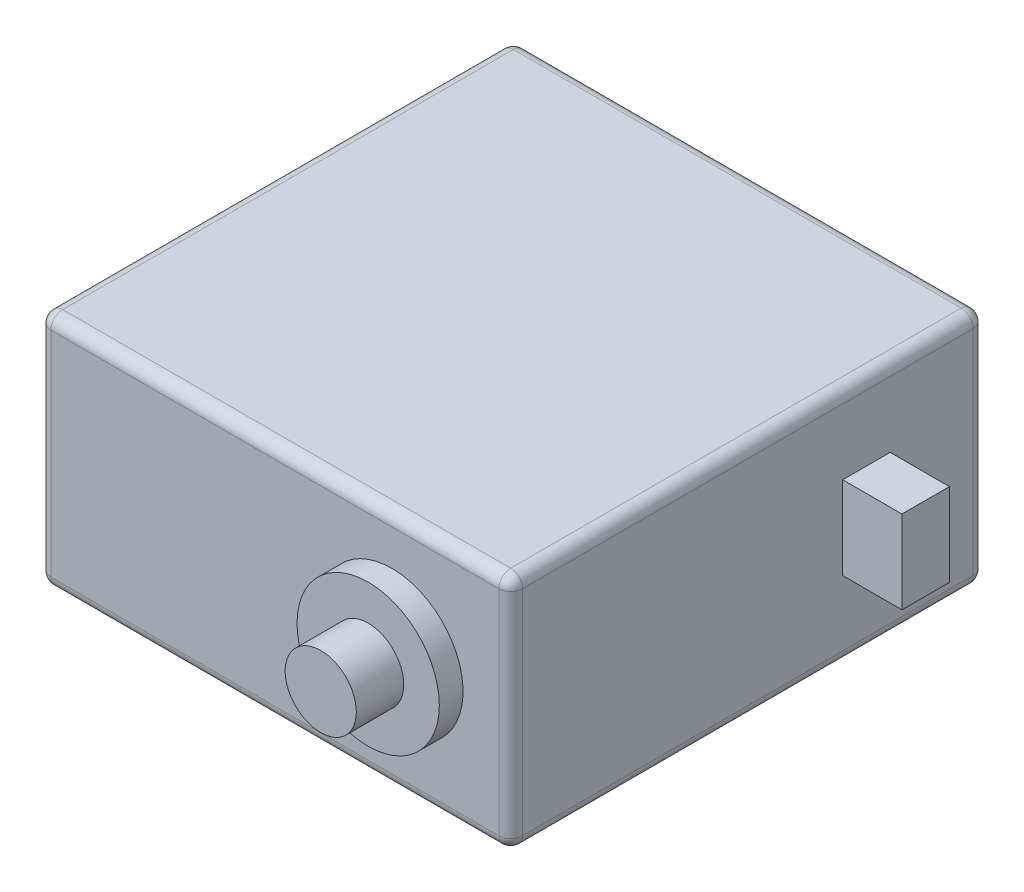
ISO-10303-21;
HEADER;
FILE_DESCRIPTION(('STEP AP214'),'2;1');
FILE_NAME('part.step','',(''),(''),'','','');
FILE_SCHEMA(('AUTOMOTIVE_DESIGN { 1 0 10303 214 1 1 1 1 }'));
ENDSEC;
DATA;
#1=APPLICATION_CONTEXT('core data for automotive mechanical design processes');
#2=APPLICATION_PROTOCOL_DEFINITION('international standard','automotive_design',2000,#1);
#3=PRODUCT_CONTEXT('',#1,'mechanical');
#4=PRODUCT('Part','Part','',(#3));
#5=PRODUCT_RELATED_PRODUCT_CATEGORY('part','',(#4));
#6=PRODUCT_DEFINITION_FORMATION('','',#4);
#7=PRODUCT_DEFINITION_CONTEXT('part definition',#1,'design');
#8=PRODUCT_DEFINITION('design','',#6,#7);
#9=PRODUCT_DEFINITION_SHAPE('','',#8);
#10=(LENGTH_UNIT() NAMED_UNIT(*) SI_UNIT(.MILLI.,.METRE.));
#11=(NAMED_UNIT(*) PLANE_ANGLE_UNIT() SI_UNIT($,.RADIAN.));
#12=(NAMED_UNIT(*) SI_UNIT($,.STERADIAN.) SOLID_ANGLE_UNIT());
#13=UNCERTAINTY_MEASURE_WITH_UNIT(LENGTH_MEASURE(1.E-05),#10,'distance_accuracy_value','');
#14=(GEOMETRIC_REPRESENTATION_CONTEXT(3) GLOBAL_UNCERTAINTY_ASSIGNED_CONTEXT((#13)) GLOBAL_UNIT_ASSIGNED_CONTEXT((#10,
#11,#12)) REPRESENTATION_CONTEXT('',''));
#15=CARTESIAN_POINT('',(0.,0.,0.));
#16=DIRECTION('',(0.,0.,1.));
#17=DIRECTION('',(1.,0.,0.));
#18=AXIS2_PLACEMENT_3D('',#15,#16,#17);
#19=CARTESIAN_POINT('',(19.89,20.04,-20.));
#20=DIRECTION('',(-1.,0.,0.));
#21=DIRECTION('',(0.,0.,1.));
#22=AXIS2_PLACEMENT_3D('',#19,#20,#21);
#23=PLANE('',#22);
#24=DIRECTION('',(0.,0.,-1.));
#25=VECTOR('',#24,1.);
#26=CARTESIAN_POINT('',(19.89,19.04,-20.));
#27=LINE('',#26,#25);
#28=CARTESIAN_POINT('',(19.89,19.04,-19.));
#29=VERTEX_POINT('',#28);
#30=CARTESIAN_POINT('',(19.89,19.04,19.));
#31=VERTEX_POINT('',#30);
#32=EDGE_CURVE('E51',#29,#31,#27,.F.);
#33=ORIENTED_EDGE('',*,*,#32,.T.);
#34=DIRECTION('',(0.,-1.,0.));
#35=VECTOR('',#34,1.);
#36=CARTESIAN_POINT('',(19.89,20.04,19.));
#37=LINE('',#36,#35);
#38=CARTESIAN_POINT('',(19.89,1.,19.));
#39=VERTEX_POINT('',#38);
#40=EDGE_CURVE('E11',#31,#39,#37,.T.);
#41=ORIENTED_EDGE('',*,*,#40,.T.);
#42=DIRECTION('',(0.,0.,-1.));
#43=VECTOR('',#42,1.);
#44=CARTESIAN_POINT('',(19.89,1.,-20.));
#45=LINE('',#44,#43);
#46=CARTESIAN_POINT('',(19.89,1.,-19.));
#47=VERTEX_POINT('',#46);
#48=EDGE_CURVE('E243',#39,#47,#45,.T.);
#49=ORIENTED_EDGE('',*,*,#48,.T.);
#50=DIRECTION('',(0.,-1.,0.));
#51=VECTOR('',#50,1.);
#52=CARTESIAN_POINT('',(19.89,20.04,-19.));
#53=LINE('',#52,#51);
#54=EDGE_CURVE('E245',#47,#29,#53,.F.);
#55=ORIENTED_EDGE('',*,*,#54,.T.);
#56=EDGE_LOOP('',(#33,#41,#49,#55));
#57=FACE_BOUND('',#56,.T.);
#58=DIRECTION('',(0.,-1.,0.));
#59=VECTOR('',#58,1.);
#60=CARTESIAN_POINT('',(19.89,13.5,-8.));
#61=LINE('',#60,#59);
#62=CARTESIAN_POINT('',(19.89,13.5,-8.));
#63=VERTEX_POINT('',#62);
#64=CARTESIAN_POINT('',(19.89,6.5,-8.));
#65=VERTEX_POINT('',#64);
#66=EDGE_CURVE('E177',#63,#65,#61,.T.);
#67=ORIENTED_EDGE('',*,*,#66,.F.);
#68=DIRECTION('',(0.,0.,1.));
#69=VECTOR('',#68,1.);
#70=CARTESIAN_POINT('',(19.89,13.5,-12.));
#71=LINE('',#70,#69);
#72=CARTESIAN_POINT('',(19.89,13.5,-12.));
#73=VERTEX_POINT('',#72);
#74=EDGE_CURVE('E174',#73,#63,#71,.T.);
#75=ORIENTED_EDGE('',*,*,#74,.F.);
#76=DIRECTION('',(0.,1.,0.));
#77=VECTOR('',#76,1.);
#78=CARTESIAN_POINT('',(19.89,13.5,-12.));
#79=LINE('',#78,#77);
#80=CARTESIAN_POINT('',(19.89,6.5,-12.));
#81=VERTEX_POINT('',#80);
#82=EDGE_CURVE('E64',#81,#73,#79,.T.);
#83=ORIENTED_EDGE('',*,*,#82,.F.);
#84=DIRECTION('',(0.,0.,-1.));
#85=VECTOR('',#84,1.);
#86=CARTESIAN_POINT('',(19.89,6.5,-12.));
#87=LINE('',#86,#85);
#88=EDGE_CURVE('E59',#65,#81,#87,.T.);
#89=ORIENTED_EDGE('',*,*,#88,.F.);
#90=EDGE_LOOP('',(#67,#75,#83,#89));
#91=FACE_BOUND('',#90,.T.);
#92=ADVANCED_FACE('F42',(#57,#91),#23,.F.);
#93=CARTESIAN_POINT('',(-19.89,20.04,-20.));
#94=DIRECTION('',(1.,0.,0.));
#95=DIRECTION('',(0.,0.,-1.));
#96=AXIS2_PLACEMENT_3D('',#93,#94,#95);
#97=PLANE('',#96);
#98=DIRECTION('',(0.,-1.,0.));
#99=VECTOR('',#98,1.);
#100=CARTESIAN_POINT('',(-19.89,20.04,19.));
#101=LINE('',#100,#99);
#102=CARTESIAN_POINT('',(-19.89,1.,19.));
#103=VERTEX_POINT('',#102);
#104=CARTESIAN_POINT('',(-19.89,19.04,19.));
#105=VERTEX_POINT('',#104);
#106=EDGE_CURVE('E200',#103,#105,#101,.F.);
#107=ORIENTED_EDGE('',*,*,#106,.T.);
#108=DIRECTION('',(0.,0.,1.));
#109=VECTOR('',#108,1.);
#110=CARTESIAN_POINT('',(-19.89,19.04,-20.));
#111=LINE('',#110,#109);
#112=CARTESIAN_POINT('',(-19.89,19.04,-19.));
#113=VERTEX_POINT('',#112);
#114=EDGE_CURVE('E205',#105,#113,#111,.F.);
#115=ORIENTED_EDGE('',*,*,#114,.T.);
#116=DIRECTION('',(0.,-1.,0.));
#117=VECTOR('',#116,1.);
#118=CARTESIAN_POINT('',(-19.89,20.04,-19.));
#119=LINE('',#118,#117);
#120=CARTESIAN_POINT('',(-19.89,1.,-19.));
#121=VERTEX_POINT('',#120);
#122=EDGE_CURVE('E202',#113,#121,#119,.T.);
#123=ORIENTED_EDGE('',*,*,#122,.T.);
#124=DIRECTION('',(0.,0.,1.));
#125=VECTOR('',#124,1.);
#126=CARTESIAN_POINT('',(-19.89,1.,20.));
#127=LINE('',#126,#125);
#128=EDGE_CURVE('E193',#121,#103,#127,.T.);
#129=ORIENTED_EDGE('',*,*,#128,.T.);
#130=EDGE_LOOP('',(#107,#115,#123,#129));
#131=FACE_BOUND('',#130,.T.);
#132=ADVANCED_FACE('F399',(#131),#97,.F.);
#133=CARTESIAN_POINT('',(19.89,20.04,20.));
#134=DIRECTION('',(0.,0.,-1.));
#135=DIRECTION('',(-1.,0.,0.));
#136=AXIS2_PLACEMENT_3D('',#133,#134,#135);
#137=PLANE('',#136);
#138=DIRECTION('',(1.,0.,0.));
#139=VECTOR('',#138,1.);
#140=CARTESIAN_POINT('',(19.89,19.04,20.));
#141=LINE('',#140,#139);
#142=CARTESIAN_POINT('',(18.89,19.04,20.));
#143=VERTEX_POINT('',#142);
#144=CARTESIAN_POINT('',(-18.89,19.04,20.));
#145=VERTEX_POINT('',#144);
#146=EDGE_CURVE('E220',#143,#145,#141,.F.);
#147=ORIENTED_EDGE('',*,*,#146,.T.);
#148=DIRECTION('',(0.,-1.,0.));
#149=VECTOR('',#148,1.);
#150=CARTESIAN_POINT('',(-18.89,20.04,20.));
#151=LINE('',#150,#149);
#152=CARTESIAN_POINT('',(-18.89,1.,20.));
#153=VERTEX_POINT('',#152);
#154=EDGE_CURVE('E222',#145,#153,#151,.T.);
#155=ORIENTED_EDGE('',*,*,#154,.T.);
#156=DIRECTION('',(1.,0.,0.));
#157=VECTOR('',#156,1.);
#158=CARTESIAN_POINT('',(19.89,1.,20.));
#159=LINE('',#158,#157);
#160=CARTESIAN_POINT('',(18.89,1.,20.));
#161=VERTEX_POINT('',#160);
#162=EDGE_CURVE('E218',#153,#161,#159,.T.);
#163=ORIENTED_EDGE('',*,*,#162,.T.);
#164=DIRECTION('',(0.,-1.,0.));
#165=VECTOR('',#164,1.);
#166=CARTESIAN_POINT('',(18.89,20.04,20.));
#167=LINE('',#166,#165);
#168=EDGE_CURVE('E216',#161,#143,#167,.F.);
#169=ORIENTED_EDGE('',*,*,#168,.T.);
#170=EDGE_LOOP('',(#147,#155,#163,#169));
#171=FACE_BOUND('',#170,.T.);
#172=CARTESIAN_POINT('',(9.87,10.02,20.));
#173=DIRECTION('',(0.,0.,-1.));
#174=DIRECTION('',(-1.,0.,0.));
#175=AXIS2_PLACEMENT_3D('',#172,#173,#174);
#176=CIRCLE('',#175,6.);
#177=CARTESIAN_POINT('',(3.87,10.02,20.));
#178=VERTEX_POINT('',#177);
#179=EDGE_CURVE('E194',#178,#178,#176,.F.);
#180=ORIENTED_EDGE('',*,*,#179,.F.);
#181=EDGE_LOOP('',(#180));
#182=FACE_BOUND('',#181,.T.);
#183=ADVANCED_FACE('F339',(#171,#182),#137,.F.);
#184=CARTESIAN_POINT('',(19.89,20.04,-20.));
#185=DIRECTION('',(0.,0.,1.));
#186=DIRECTION('',(1.,0.,0.));
#187=AXIS2_PLACEMENT_3D('',#184,#185,#186);
#188=PLANE('',#187);
#189=CARTESIAN_POINT('',(9.87,10.02,-20.));
#190=DIRECTION('',(0.,0.,1.));
#191=DIRECTION('',(1.,0.,0.));
#192=AXIS2_PLACEMENT_3D('',#189,#190,#191);
#193=CIRCLE('',#192,6.);
#194=CARTESIAN_POINT('',(15.87,10.02,-20.));
#195=VERTEX_POINT('',#194);
#196=EDGE_CURVE('E750',#195,#195,#193,.T.);
#197=ORIENTED_EDGE('',*,*,#196,.T.);
#198=EDGE_LOOP('',(#197));
#199=FACE_BOUND('',#198,.T.);
#200=DIRECTION('',(-1.,0.,0.));
#201=VECTOR('',#200,1.);
#202=CARTESIAN_POINT('',(-19.89,1.,-20.));
#203=LINE('',#202,#201);
#204=CARTESIAN_POINT('',(18.89,1.,-20.));
#205=VERTEX_POINT('',#204);
#206=CARTESIAN_POINT('',(-18.89,1.,-20.));
#207=VERTEX_POINT('',#206);
#208=EDGE_CURVE('E209',#205,#207,#203,.T.);
#209=ORIENTED_EDGE('',*,*,#208,.T.);
#210=DIRECTION('',(0.,-1.,0.));
#211=VECTOR('',#210,1.);
#212=CARTESIAN_POINT('',(-18.89,20.04,-20.));
#213=LINE('',#212,#211);
#214=CARTESIAN_POINT('',(-18.89,19.04,-20.));
#215=VERTEX_POINT('',#214);
#216=EDGE_CURVE('E213',#207,#215,#213,.F.);
#217=ORIENTED_EDGE('',*,*,#216,.T.);
#218=DIRECTION('',(-1.,0.,0.));
#219=VECTOR('',#218,1.);
#220=CARTESIAN_POINT('',(19.89,19.04,-20.));
#221=LINE('',#220,#219);
#222=CARTESIAN_POINT('',(18.89,19.04,-20.));
#223=VERTEX_POINT('',#222);
#224=EDGE_CURVE('E211',#215,#223,#221,.F.);
#225=ORIENTED_EDGE('',*,*,#224,.T.);
#226=DIRECTION('',(0.,-1.,0.));
#227=VECTOR('',#226,1.);
#228=CARTESIAN_POINT('',(18.89,20.04,-20.));
#229=LINE('',#228,#227);
#230=EDGE_CURVE('E207',#223,#205,#229,.T.);
#231=ORIENTED_EDGE('',*,*,#230,.T.);
#232=EDGE_LOOP('',(#209,#217,#225,#231));
#233=FACE_BOUND('',#232,.T.);
#234=ADVANCED_FACE('F374',(#199,#233),#188,.F.);
#235=CARTESIAN_POINT('',(0.,20.04,0.));
#236=DIRECTION('',(0.,-1.,0.));
#237=DIRECTION('',(0.,0.,-1.));
#238=AXIS2_PLACEMENT_3D('',#235,#236,#237);
#239=PLANE('',#238);
#240=DIRECTION('',(-1.,0.,0.));
#241=VECTOR('',#240,1.);
#242=CARTESIAN_POINT('',(0.,20.04,-19.));
#243=LINE('',#242,#241);
#244=CARTESIAN_POINT('',(18.89,20.04,-19.));
#245=VERTEX_POINT('',#244);
#246=CARTESIAN_POINT('',(-18.89,20.04,-19.));
#247=VERTEX_POINT('',#246);
#248=EDGE_CURVE('E229',#245,#247,#243,.T.);
#249=ORIENTED_EDGE('',*,*,#248,.T.);
#250=DIRECTION('',(0.,0.,1.));
#251=VECTOR('',#250,1.);
#252=CARTESIAN_POINT('',(-18.89,20.04,0.));
#253=LINE('',#252,#251);
#254=CARTESIAN_POINT('',(-18.89,20.04,19.));
#255=VERTEX_POINT('',#254);
#256=EDGE_CURVE('E232',#247,#255,#253,.T.);
#257=ORIENTED_EDGE('',*,*,#256,.T.);
#258=DIRECTION('',(1.,0.,0.));
#259=VECTOR('',#258,1.);
#260=CARTESIAN_POINT('',(0.,20.04,19.));
#261=LINE('',#260,#259);
#262=CARTESIAN_POINT('',(18.89,20.04,19.));
#263=VERTEX_POINT('',#262);
#264=EDGE_CURVE('E227',#255,#263,#261,.T.);
#265=ORIENTED_EDGE('',*,*,#264,.T.);
#266=DIRECTION('',(0.,0.,-1.));
#267=VECTOR('',#266,1.);
#268=CARTESIAN_POINT('',(18.89,20.04,0.));
#269=LINE('',#268,#267);
#270=EDGE_CURVE('E225',#263,#245,#269,.T.);
#271=ORIENTED_EDGE('',*,*,#270,.T.);
#272=EDGE_LOOP('',(#249,#257,#265,#271));
#273=FACE_BOUND('',#272,.T.);
#274=ADVANCED_FACE('F330',(#273),#239,.F.);
#275=CARTESIAN_POINT('',(0.,0.,0.));
#276=DIRECTION('',(0.,-1.,0.));
#277=DIRECTION('',(0.,0.,-1.));
#278=AXIS2_PLACEMENT_3D('',#275,#276,#277);
#279=PLANE('',#278);
#280=DIRECTION('',(1.,0.,0.));
#281=VECTOR('',#280,1.);
#282=CARTESIAN_POINT('',(-19.89,0.,19.));
#283=LINE('',#282,#281);
#284=CARTESIAN_POINT('',(18.89,0.,19.));
#285=VERTEX_POINT('',#284);
#286=CARTESIAN_POINT('',(-18.89,0.,19.));
#287=VERTEX_POINT('',#286);
#288=EDGE_CURVE('E238',#285,#287,#283,.F.);
#289=ORIENTED_EDGE('',*,*,#288,.T.);
#290=DIRECTION('',(0.,0.,1.));
#291=VECTOR('',#290,1.);
#292=CARTESIAN_POINT('',(-18.89,0.,-20.));
#293=LINE('',#292,#291);
#294=CARTESIAN_POINT('',(-18.89,0.,-19.));
#295=VERTEX_POINT('',#294);
#296=EDGE_CURVE('E241',#287,#295,#293,.F.);
#297=ORIENTED_EDGE('',*,*,#296,.T.);
#298=DIRECTION('',(-1.,0.,0.));
#299=VECTOR('',#298,1.);
#300=CARTESIAN_POINT('',(19.89,0.,-19.));
#301=LINE('',#300,#299);
#302=CARTESIAN_POINT('',(18.89,0.,-19.));
#303=VERTEX_POINT('',#302);
#304=EDGE_CURVE('E236',#295,#303,#301,.F.);
#305=ORIENTED_EDGE('',*,*,#304,.T.);
#306=DIRECTION('',(0.,0.,-1.));
#307=VECTOR('',#306,1.);
#308=CARTESIAN_POINT('',(18.89,0.,20.));
#309=LINE('',#308,#307);
#310=EDGE_CURVE('E234',#303,#285,#309,.F.);
#311=ORIENTED_EDGE('',*,*,#310,.T.);
#312=EDGE_LOOP('',(#289,#297,#305,#311));
#313=FACE_BOUND('',#312,.T.);
#314=ADVANCED_FACE('F616',(#313),#279,.T.);
#315=CARTESIAN_POINT('',(9.87,10.02,22.));
#316=DIRECTION('',(0.,0.,-1.));
#317=DIRECTION('',(-1.,0.,0.));
#318=AXIS2_PLACEMENT_3D('',#315,#316,#317);
#319=CYLINDRICAL_SURFACE('',#318,6.);
#320=CARTESIAN_POINT('',(9.87,10.02,22.));
#321=DIRECTION('',(0.,0.,1.));
#322=DIRECTION('',(1.,0.,0.));
#323=AXIS2_PLACEMENT_3D('',#320,#321,#322);
#324=CIRCLE('',#323,6.);
#325=CARTESIAN_POINT('',(15.87,10.02,22.));
#326=VERTEX_POINT('',#325);
#327=EDGE_CURVE('E189',#326,#326,#324,.T.);
#328=ORIENTED_EDGE('',*,*,#327,.F.);
#329=EDGE_LOOP('',(#328));
#330=FACE_BOUND('',#329,.T.);
#331=ORIENTED_EDGE('',*,*,#179,.T.);
#332=EDGE_LOOP('',(#331));
#333=FACE_BOUND('',#332,.T.);
#334=ADVANCED_FACE('F607',(#330,#333),#319,.T.);
#335=CARTESIAN_POINT('',(9.87,10.02,22.));
#336=DIRECTION('',(0.,0.,1.));
#337=DIRECTION('',(1.,0.,0.));
#338=AXIS2_PLACEMENT_3D('',#335,#336,#337);
#339=PLANE('',#338);
#340=CARTESIAN_POINT('',(9.87,10.02,22.));
#341=DIRECTION('',(0.,0.,1.));
#342=DIRECTION('',(1.,0.,0.));
#343=AXIS2_PLACEMENT_3D('',#340,#341,#342);
#344=CIRCLE('',#343,3.);
#345=CARTESIAN_POINT('',(12.87,10.02,22.));
#346=VERTEX_POINT('',#345);
#347=EDGE_CURVE('E190',#346,#346,#344,.T.);
#348=ORIENTED_EDGE('',*,*,#347,.F.);
#349=EDGE_LOOP('',(#348));
#350=FACE_BOUND('',#349,.T.);
#351=ORIENTED_EDGE('',*,*,#327,.T.);
#352=EDGE_LOOP('',(#351));
#353=FACE_BOUND('',#352,.T.);
#354=ADVANCED_FACE('F597',(#350,#353),#339,.T.);
#355=CARTESIAN_POINT('',(9.87,10.02,26.));
#356=DIRECTION('',(0.,0.,-1.));
#357=DIRECTION('',(-1.,0.,0.));
#358=AXIS2_PLACEMENT_3D('',#355,#356,#357);
#359=CYLINDRICAL_SURFACE('',#358,3.);
#360=CARTESIAN_POINT('',(9.87,10.02,26.));
#361=DIRECTION('',(0.,0.,1.));
#362=DIRECTION('',(1.,0.,0.));
#363=AXIS2_PLACEMENT_3D('',#360,#361,#362);
#364=CIRCLE('',#363,3.);
#365=CARTESIAN_POINT('',(12.87,10.02,26.));
#366=VERTEX_POINT('',#365);
#367=EDGE_CURVE('E186',#366,#366,#364,.T.);
#368=ORIENTED_EDGE('',*,*,#367,.F.);
#369=EDGE_LOOP('',(#368));
#370=FACE_BOUND('',#369,.T.);
#371=ORIENTED_EDGE('',*,*,#347,.T.);
#372=EDGE_LOOP('',(#371));
#373=FACE_BOUND('',#372,.T.);
#374=ADVANCED_FACE('F587',(#370,#373),#359,.T.);
#375=CARTESIAN_POINT('',(9.87,10.02,26.));
#376=DIRECTION('',(0.,0.,1.));
#377=DIRECTION('',(1.,0.,0.));
#378=AXIS2_PLACEMENT_3D('',#375,#376,#377);
#379=PLANE('',#378);
#380=ORIENTED_EDGE('',*,*,#367,.T.);
#381=EDGE_LOOP('',(#380));
#382=FACE_BOUND('',#381,.T.);
#383=ADVANCED_FACE('F583',(#382),#379,.T.);
#384=CARTESIAN_POINT('',(18.89,20.04,19.));
#385=DIRECTION('',(0.,-1.,0.));
#386=DIRECTION('',(0.,0.,-1.));
#387=AXIS2_PLACEMENT_3D('',#384,#385,#386);
#388=CYLINDRICAL_SURFACE('',#387,1.);
#389=CARTESIAN_POINT('',(18.89,19.04,19.));
#390=DIRECTION('',(0.,1.,0.));
#391=DIRECTION('',(0.,0.,1.));
#392=AXIS2_PLACEMENT_3D('',#389,#390,#391);
#393=CIRCLE('',#392,1.);
#394=EDGE_CURVE('E46',#143,#31,#393,.T.);
#395=ORIENTED_EDGE('',*,*,#394,.F.);
#396=ORIENTED_EDGE('',*,*,#168,.F.);
#397=CARTESIAN_POINT('',(18.89,1.,19.));
#398=DIRECTION('',(0.,-1.,0.));
#399=DIRECTION('',(0.,0.,-1.));
#400=AXIS2_PLACEMENT_3D('',#397,#398,#399);
#401=CIRCLE('',#400,1.);
#402=EDGE_CURVE('E306',#39,#161,#401,.T.);
#403=ORIENTED_EDGE('',*,*,#402,.F.);
#404=ORIENTED_EDGE('',*,*,#40,.F.);
#405=EDGE_LOOP('',(#395,#396,#403,#404));
#406=FACE_BOUND('',#405,.T.);
#407=ADVANCED_FACE('F44',(#406),#388,.T.);
#408=CARTESIAN_POINT('',(18.89,19.04,19.));
#409=DIRECTION('',(1.,0.,0.));
#410=DIRECTION('',(0.,0.,-1.));
#411=AXIS2_PLACEMENT_3D('',#408,#409,#410);
#412=SPHERICAL_SURFACE('',#411,1.);
#413=CARTESIAN_POINT('',(18.89,19.04,19.));
#414=DIRECTION('',(1.,0.,0.));
#415=DIRECTION('',(0.,0.,-1.));
#416=AXIS2_PLACEMENT_3D('',#413,#414,#415);
#417=CIRCLE('',#416,1.);
#418=EDGE_CURVE('E301',#143,#263,#417,.F.);
#419=ORIENTED_EDGE('',*,*,#418,.F.);
#420=ORIENTED_EDGE('',*,*,#394,.T.);
#421=CARTESIAN_POINT('',(18.89,19.04,19.));
#422=DIRECTION('',(0.,0.,1.));
#423=DIRECTION('',(0.,-1.,0.));
#424=AXIS2_PLACEMENT_3D('',#421,#422,#423);
#425=CIRCLE('',#424,1.);
#426=EDGE_CURVE('E304',#263,#31,#425,.F.);
#427=ORIENTED_EDGE('',*,*,#426,.F.);
#428=EDGE_LOOP('',(#419,#420,#427));
#429=FACE_BOUND('',#428,.T.);
#430=ADVANCED_FACE('F317',(#429),#412,.T.);
#431=CARTESIAN_POINT('',(18.89,1.,19.));
#432=DIRECTION('',(0.,0.,1.));
#433=DIRECTION('',(0.,-1.,0.));
#434=AXIS2_PLACEMENT_3D('',#431,#432,#433);
#435=SPHERICAL_SURFACE('',#434,1.);
#436=CARTESIAN_POINT('',(18.89,1.,19.));
#437=DIRECTION('',(0.,0.,1.));
#438=DIRECTION('',(1.,0.,0.));
#439=AXIS2_PLACEMENT_3D('',#436,#437,#438);
#440=CIRCLE('',#439,1.);
#441=EDGE_CURVE('E295',#39,#285,#440,.F.);
#442=ORIENTED_EDGE('',*,*,#441,.F.);
#443=ORIENTED_EDGE('',*,*,#402,.T.);
#444=CARTESIAN_POINT('',(18.89,1.,19.));
#445=DIRECTION('',(1.,0.,0.));
#446=DIRECTION('',(0.,0.,-1.));
#447=AXIS2_PLACEMENT_3D('',#444,#445,#446);
#448=CIRCLE('',#447,1.);
#449=EDGE_CURVE('E298',#285,#161,#448,.F.);
#450=ORIENTED_EDGE('',*,*,#449,.F.);
#451=EDGE_LOOP('',(#442,#443,#450));
#452=FACE_BOUND('',#451,.T.);
#453=ADVANCED_FACE('F657',(#452),#435,.T.);
#454=CARTESIAN_POINT('',(18.89,19.04,0.));
#455=DIRECTION('',(0.,0.,-1.));
#456=DIRECTION('',(-1.,0.,0.));
#457=AXIS2_PLACEMENT_3D('',#454,#455,#456);
#458=CYLINDRICAL_SURFACE('',#457,1.);
#459=ORIENTED_EDGE('',*,*,#426,.T.);
#460=ORIENTED_EDGE('',*,*,#32,.F.);
#461=CARTESIAN_POINT('',(18.89,19.04,-19.));
#462=DIRECTION('',(0.,0.,-1.));
#463=DIRECTION('',(-1.,0.,0.));
#464=AXIS2_PLACEMENT_3D('',#461,#462,#463);
#465=CIRCLE('',#464,1.);
#466=EDGE_CURVE('E289',#245,#29,#465,.T.);
#467=ORIENTED_EDGE('',*,*,#466,.F.);
#468=ORIENTED_EDGE('',*,*,#270,.F.);
#469=EDGE_LOOP('',(#459,#460,#467,#468));
#470=FACE_BOUND('',#469,.T.);
#471=ADVANCED_FACE('F325',(#470),#458,.T.);
#472=CARTESIAN_POINT('',(0.,19.04,19.));
#473=DIRECTION('',(1.,0.,0.));
#474=DIRECTION('',(0.,0.,-1.));
#475=AXIS2_PLACEMENT_3D('',#472,#473,#474);
#476=CYLINDRICAL_SURFACE('',#475,1.);
#477=ORIENTED_EDGE('',*,*,#418,.T.);
#478=ORIENTED_EDGE('',*,*,#264,.F.);
#479=CARTESIAN_POINT('',(-18.89,19.04,19.));
#480=DIRECTION('',(-1.,0.,0.));
#481=DIRECTION('',(0.,0.,1.));
#482=AXIS2_PLACEMENT_3D('',#479,#480,#481);
#483=CIRCLE('',#482,1.);
#484=EDGE_CURVE('E286',#145,#255,#483,.T.);
#485=ORIENTED_EDGE('',*,*,#484,.F.);
#486=ORIENTED_EDGE('',*,*,#146,.F.);
#487=EDGE_LOOP('',(#477,#478,#485,#486));
#488=FACE_BOUND('',#487,.T.);
#489=ADVANCED_FACE('F336',(#488),#476,.T.);
#490=CARTESIAN_POINT('',(-18.89,20.04,19.));
#491=DIRECTION('',(0.,-1.,0.));
#492=DIRECTION('',(0.,0.,-1.));
#493=AXIS2_PLACEMENT_3D('',#490,#491,#492);
#494=CYLINDRICAL_SURFACE('',#493,1.);
#495=CARTESIAN_POINT('',(-18.89,1.,19.));
#496=DIRECTION('',(0.,-1.,0.));
#497=DIRECTION('',(0.,0.,-1.));
#498=AXIS2_PLACEMENT_3D('',#495,#496,#497);
#499=CIRCLE('',#498,1.);
#500=EDGE_CURVE('E280',#153,#103,#499,.T.);
#501=ORIENTED_EDGE('',*,*,#500,.F.);
#502=ORIENTED_EDGE('',*,*,#154,.F.);
#503=CARTESIAN_POINT('',(-18.89,19.04,19.));
#504=DIRECTION('',(0.,1.,0.));
#505=DIRECTION('',(0.,0.,1.));
#506=AXIS2_PLACEMENT_3D('',#503,#504,#505);
#507=CIRCLE('',#506,1.);
#508=EDGE_CURVE('E283',#105,#145,#507,.T.);
#509=ORIENTED_EDGE('',*,*,#508,.F.);
#510=ORIENTED_EDGE('',*,*,#106,.F.);
#511=EDGE_LOOP('',(#501,#502,#509,#510));
#512=FACE_BOUND('',#511,.T.);
#513=ADVANCED_FACE('F344',(#512),#494,.T.);
#514=CARTESIAN_POINT('',(19.89,1.,19.));
#515=DIRECTION('',(-1.,0.,0.));
#516=DIRECTION('',(0.,0.,1.));
#517=AXIS2_PLACEMENT_3D('',#514,#515,#516);
#518=CYLINDRICAL_SURFACE('',#517,1.);
#519=ORIENTED_EDGE('',*,*,#449,.T.);
#520=ORIENTED_EDGE('',*,*,#162,.F.);
#521=CARTESIAN_POINT('',(-18.89,1.,19.));
#522=DIRECTION('',(-1.,0.,0.));
#523=DIRECTION('',(0.,0.,1.));
#524=AXIS2_PLACEMENT_3D('',#521,#522,#523);
#525=CIRCLE('',#524,1.);
#526=EDGE_CURVE('E278',#287,#153,#525,.T.);
#527=ORIENTED_EDGE('',*,*,#526,.F.);
#528=ORIENTED_EDGE('',*,*,#288,.F.);
#529=EDGE_LOOP('',(#519,#520,#527,#528));
#530=FACE_BOUND('',#529,.T.);
#531=ADVANCED_FACE('F352',(#530),#518,.T.);
#532=CARTESIAN_POINT('',(18.89,1.,-20.));
#533=DIRECTION('',(0.,0.,1.));
#534=DIRECTION('',(1.,0.,0.));
#535=AXIS2_PLACEMENT_3D('',#532,#533,#534);
#536=CYLINDRICAL_SURFACE('',#535,1.);
#537=ORIENTED_EDGE('',*,*,#441,.T.);
#538=ORIENTED_EDGE('',*,*,#310,.F.);
#539=CARTESIAN_POINT('',(18.89,1.,-19.));
#540=DIRECTION('',(0.,0.,-1.));
#541=DIRECTION('',(-1.,0.,0.));
#542=AXIS2_PLACEMENT_3D('',#539,#540,#541);
#543=CIRCLE('',#542,1.);
#544=EDGE_CURVE('E275',#47,#303,#543,.T.);
#545=ORIENTED_EDGE('',*,*,#544,.F.);
#546=ORIENTED_EDGE('',*,*,#48,.F.);
#547=EDGE_LOOP('',(#537,#538,#545,#546));
#548=FACE_BOUND('',#547,.T.);
#549=ADVANCED_FACE('F364',(#548),#536,.T.);
#550=CARTESIAN_POINT('',(18.89,20.04,-19.));
#551=DIRECTION('',(0.,-1.,0.));
#552=DIRECTION('',(0.,0.,-1.));
#553=AXIS2_PLACEMENT_3D('',#550,#551,#552);
#554=CYLINDRICAL_SURFACE('',#553,1.);
#555=CARTESIAN_POINT('',(18.89,19.04,-19.));
#556=DIRECTION('',(0.,1.,0.));
#557=DIRECTION('',(0.,0.,1.));
#558=AXIS2_PLACEMENT_3D('',#555,#556,#557);
#559=CIRCLE('',#558,1.);
#560=EDGE_CURVE('E292',#29,#223,#559,.T.);
#561=ORIENTED_EDGE('',*,*,#560,.F.);
#562=ORIENTED_EDGE('',*,*,#54,.F.);
#563=CARTESIAN_POINT('',(18.89,1.,-19.));
#564=DIRECTION('',(0.,-1.,0.));
#565=DIRECTION('',(0.,0.,-1.));
#566=AXIS2_PLACEMENT_3D('',#563,#564,#565);
#567=CIRCLE('',#566,1.);
#568=EDGE_CURVE('E272',#205,#47,#567,.T.);
#569=ORIENTED_EDGE('',*,*,#568,.F.);
#570=ORIENTED_EDGE('',*,*,#230,.F.);
#571=EDGE_LOOP('',(#561,#562,#569,#570));
#572=FACE_BOUND('',#571,.T.);
#573=ADVANCED_FACE('F359',(#572),#554,.T.);
#574=CARTESIAN_POINT('',(18.89,19.04,-19.));
#575=DIRECTION('',(1.,0.,0.));
#576=DIRECTION('',(0.,0.,-1.));
#577=AXIS2_PLACEMENT_3D('',#574,#575,#576);
#578=SPHERICAL_SURFACE('',#577,1.);
#579=ORIENTED_EDGE('',*,*,#466,.T.);
#580=ORIENTED_EDGE('',*,*,#560,.T.);
#581=CARTESIAN_POINT('',(18.89,19.04,-19.));
#582=DIRECTION('',(1.,0.,0.));
#583=DIRECTION('',(0.,1.,0.));
#584=AXIS2_PLACEMENT_3D('',#581,#582,#583);
#585=CIRCLE('',#584,1.);
#586=EDGE_CURVE('E269',#245,#223,#585,.F.);
#587=ORIENTED_EDGE('',*,*,#586,.F.);
#588=EDGE_LOOP('',(#579,#580,#587));
#589=FACE_BOUND('',#588,.T.);
#590=ADVANCED_FACE('F377',(#589),#578,.T.);
#591=CARTESIAN_POINT('',(-18.89,19.04,19.));
#592=DIRECTION('',(0.,0.,1.));
#593=DIRECTION('',(1.,0.,0.));
#594=AXIS2_PLACEMENT_3D('',#591,#592,#593);
#595=SPHERICAL_SURFACE('',#594,1.);
#596=ORIENTED_EDGE('',*,*,#508,.T.);
#597=ORIENTED_EDGE('',*,*,#484,.T.);
#598=CARTESIAN_POINT('',(-18.89,19.04,19.));
#599=DIRECTION('',(0.,0.,1.));
#600=DIRECTION('',(1.,0.,0.));
#601=AXIS2_PLACEMENT_3D('',#598,#599,#600);
#602=CIRCLE('',#601,1.);
#603=EDGE_CURVE('E266',#105,#255,#602,.F.);
#604=ORIENTED_EDGE('',*,*,#603,.F.);
#605=EDGE_LOOP('',(#596,#597,#604));
#606=FACE_BOUND('',#605,.T.);
#607=ADVANCED_FACE('F388',(#606),#595,.T.);
#608=CARTESIAN_POINT('',(-18.89,1.,19.));
#609=DIRECTION('',(0.,0.,1.));
#610=DIRECTION('',(0.,-1.,0.));
#611=AXIS2_PLACEMENT_3D('',#608,#609,#610);
#612=SPHERICAL_SURFACE('',#611,1.);
#613=ORIENTED_EDGE('',*,*,#526,.T.);
#614=ORIENTED_EDGE('',*,*,#500,.T.);
#615=CARTESIAN_POINT('',(-18.89,1.,19.));
#616=DIRECTION('',(0.,0.,1.));
#617=DIRECTION('',(1.,0.,0.));
#618=AXIS2_PLACEMENT_3D('',#615,#616,#617);
#619=CIRCLE('',#618,1.);
#620=EDGE_CURVE('E263',#287,#103,#619,.F.);
#621=ORIENTED_EDGE('',*,*,#620,.F.);
#622=EDGE_LOOP('',(#613,#614,#621));
#623=FACE_BOUND('',#622,.T.);
#624=ADVANCED_FACE('F390',(#623),#612,.T.);
#625=CARTESIAN_POINT('',(18.89,1.,-19.));
#626=DIRECTION('',(1.,0.,0.));
#627=DIRECTION('',(0.,1.,0.));
#628=AXIS2_PLACEMENT_3D('',#625,#626,#627);
#629=SPHERICAL_SURFACE('',#628,1.);
#630=ORIENTED_EDGE('',*,*,#568,.T.);
#631=ORIENTED_EDGE('',*,*,#544,.T.);
#632=CARTESIAN_POINT('',(18.89,1.,-19.));
#633=DIRECTION('',(1.,0.,0.));
#634=DIRECTION('',(0.,0.,-1.));
#635=AXIS2_PLACEMENT_3D('',#632,#633,#634);
#636=CIRCLE('',#635,1.);
#637=EDGE_CURVE('E260',#205,#303,#636,.F.);
#638=ORIENTED_EDGE('',*,*,#637,.F.);
#639=EDGE_LOOP('',(#630,#631,#638));
#640=FACE_BOUND('',#639,.T.);
#641=ADVANCED_FACE('F366',(#640),#629,.T.);
#642=CARTESIAN_POINT('',(0.,19.04,-19.));
#643=DIRECTION('',(-1.,0.,0.));
#644=DIRECTION('',(0.,0.,1.));
#645=AXIS2_PLACEMENT_3D('',#642,#643,#644);
#646=CYLINDRICAL_SURFACE('',#645,1.);
#647=ORIENTED_EDGE('',*,*,#586,.T.);
#648=ORIENTED_EDGE('',*,*,#224,.F.);
#649=CARTESIAN_POINT('',(-18.89,19.04,-19.));
#650=DIRECTION('',(-1.,0.,0.));
#651=DIRECTION('',(0.,0.,1.));
#652=AXIS2_PLACEMENT_3D('',#649,#650,#651);
#653=CIRCLE('',#652,1.);
#654=EDGE_CURVE('E257',#247,#215,#653,.T.);
#655=ORIENTED_EDGE('',*,*,#654,.F.);
#656=ORIENTED_EDGE('',*,*,#248,.F.);
#657=EDGE_LOOP('',(#647,#648,#655,#656));
#658=FACE_BOUND('',#657,.T.);
#659=ADVANCED_FACE('F379',(#658),#646,.T.);
#660=CARTESIAN_POINT('',(-18.89,19.04,0.));
#661=DIRECTION('',(0.,0.,1.));
#662=DIRECTION('',(1.,0.,0.));
#663=AXIS2_PLACEMENT_3D('',#660,#661,#662);
#664=CYLINDRICAL_SURFACE('',#663,1.);
#665=ORIENTED_EDGE('',*,*,#603,.T.);
#666=ORIENTED_EDGE('',*,*,#256,.F.);
#667=CARTESIAN_POINT('',(-18.89,19.04,-19.));
#668=DIRECTION('',(0.,0.,-1.));
#669=DIRECTION('',(-1.,0.,0.));
#670=AXIS2_PLACEMENT_3D('',#667,#668,#669);
#671=CIRCLE('',#670,1.);
#672=EDGE_CURVE('E255',#113,#247,#671,.T.);
#673=ORIENTED_EDGE('',*,*,#672,.F.);
#674=ORIENTED_EDGE('',*,*,#114,.F.);
#675=EDGE_LOOP('',(#665,#666,#673,#674));
#676=FACE_BOUND('',#675,.T.);
#677=ADVANCED_FACE('F385',(#676),#664,.T.);
#678=CARTESIAN_POINT('',(-18.89,1.,-20.));
#679=DIRECTION('',(0.,0.,-1.));
#680=DIRECTION('',(-1.,0.,0.));
#681=AXIS2_PLACEMENT_3D('',#678,#679,#680);
#682=CYLINDRICAL_SURFACE('',#681,1.);
#683=ORIENTED_EDGE('',*,*,#620,.T.);
#684=ORIENTED_EDGE('',*,*,#128,.F.);
#685=CARTESIAN_POINT('',(-18.89,1.,-19.));
#686=DIRECTION('',(0.,0.,-1.));
#687=DIRECTION('',(-1.,0.,0.));
#688=AXIS2_PLACEMENT_3D('',#685,#686,#687);
#689=CIRCLE('',#688,1.);
#690=EDGE_CURVE('E252',#295,#121,#689,.T.);
#691=ORIENTED_EDGE('',*,*,#690,.F.);
#692=ORIENTED_EDGE('',*,*,#296,.F.);
#693=EDGE_LOOP('',(#683,#684,#691,#692));
#694=FACE_BOUND('',#693,.T.);
#695=ADVANCED_FACE('F425',(#694),#682,.T.);
#696=CARTESIAN_POINT('',(19.89,1.,-19.));
#697=DIRECTION('',(1.,0.,0.));
#698=DIRECTION('',(0.,0.,-1.));
#699=AXIS2_PLACEMENT_3D('',#696,#697,#698);
#700=CYLINDRICAL_SURFACE('',#699,1.);
#701=ORIENTED_EDGE('',*,*,#637,.T.);
#702=ORIENTED_EDGE('',*,*,#304,.F.);
#703=CARTESIAN_POINT('',(-18.89,1.,-19.));
#704=DIRECTION('',(-1.,0.,0.));
#705=DIRECTION('',(0.,0.,1.));
#706=AXIS2_PLACEMENT_3D('',#703,#704,#705);
#707=CIRCLE('',#706,1.);
#708=EDGE_CURVE('E249',#207,#295,#707,.T.);
#709=ORIENTED_EDGE('',*,*,#708,.F.);
#710=ORIENTED_EDGE('',*,*,#208,.F.);
#711=EDGE_LOOP('',(#701,#702,#709,#710));
#712=FACE_BOUND('',#711,.T.);
#713=ADVANCED_FACE('F371',(#712),#700,.T.);
#714=CARTESIAN_POINT('',(-18.89,19.04,-19.));
#715=DIRECTION('',(0.,1.,0.));
#716=DIRECTION('',(0.,0.,1.));
#717=AXIS2_PLACEMENT_3D('',#714,#715,#716);
#718=SPHERICAL_SURFACE('',#717,1.);
#719=ORIENTED_EDGE('',*,*,#672,.T.);
#720=ORIENTED_EDGE('',*,*,#654,.T.);
#721=CARTESIAN_POINT('',(-18.89,19.04,-19.));
#722=DIRECTION('',(0.,1.,0.));
#723=DIRECTION('',(0.,0.,1.));
#724=AXIS2_PLACEMENT_3D('',#721,#722,#723);
#725=CIRCLE('',#724,1.);
#726=EDGE_CURVE('E180',#113,#215,#725,.F.);
#727=ORIENTED_EDGE('',*,*,#726,.F.);
#728=EDGE_LOOP('',(#719,#720,#727));
#729=FACE_BOUND('',#728,.T.);
#730=ADVANCED_FACE('F419',(#729),#718,.T.);
#731=CARTESIAN_POINT('',(-18.89,1.,-19.));
#732=DIRECTION('',(0.,-1.,0.));
#733=DIRECTION('',(0.,0.,-1.));
#734=AXIS2_PLACEMENT_3D('',#731,#732,#733);
#735=SPHERICAL_SURFACE('',#734,1.);
#736=ORIENTED_EDGE('',*,*,#708,.T.);
#737=ORIENTED_EDGE('',*,*,#690,.T.);
#738=CARTESIAN_POINT('',(-18.89,1.,-19.));
#739=DIRECTION('',(0.,-1.,0.));
#740=DIRECTION('',(0.,0.,-1.));
#741=AXIS2_PLACEMENT_3D('',#738,#739,#740);
#742=CIRCLE('',#741,1.);
#743=EDGE_CURVE('E178',#207,#121,#742,.F.);
#744=ORIENTED_EDGE('',*,*,#743,.F.);
#745=EDGE_LOOP('',(#736,#737,#744));
#746=FACE_BOUND('',#745,.T.);
#747=ADVANCED_FACE('F415',(#746),#735,.T.);
#748=CARTESIAN_POINT('',(-18.89,20.04,-19.));
#749=DIRECTION('',(0.,-1.,0.));
#750=DIRECTION('',(0.,0.,-1.));
#751=AXIS2_PLACEMENT_3D('',#748,#749,#750);
#752=CYLINDRICAL_SURFACE('',#751,1.);
#753=ORIENTED_EDGE('',*,*,#726,.T.);
#754=ORIENTED_EDGE('',*,*,#216,.F.);
#755=ORIENTED_EDGE('',*,*,#743,.T.);
#756=ORIENTED_EDGE('',*,*,#122,.F.);
#757=EDGE_LOOP('',(#753,#754,#755,#756));
#758=FACE_BOUND('',#757,.T.);
#759=ADVANCED_FACE('F413',(#758),#752,.T.);
#760=CARTESIAN_POINT('',(24.89,13.5,-8.));
#761=DIRECTION('',(0.,0.,-1.));
#762=DIRECTION('',(0.,1.,0.));
#763=AXIS2_PLACEMENT_3D('',#760,#761,#762);
#764=PLANE('',#763);
#765=ORIENTED_EDGE('',*,*,#66,.T.);
#766=DIRECTION('',(-1.,0.,0.));
#767=VECTOR('',#766,1.);
#768=CARTESIAN_POINT('',(24.89,6.5,-8.));
#769=LINE('',#768,#767);
#770=CARTESIAN_POINT('',(24.89,6.5,-8.));
#771=VERTEX_POINT('',#770);
#772=EDGE_CURVE('E158',#771,#65,#769,.T.);
#773=ORIENTED_EDGE('',*,*,#772,.F.);
#774=DIRECTION('',(0.,-1.,0.));
#775=VECTOR('',#774,1.);
#776=CARTESIAN_POINT('',(24.89,13.5,-8.));
#777=LINE('',#776,#775);
#778=CARTESIAN_POINT('',(24.89,13.5,-8.));
#779=VERTEX_POINT('',#778);
#780=EDGE_CURVE('E165',#779,#771,#777,.T.);
#781=ORIENTED_EDGE('',*,*,#780,.F.);
#782=DIRECTION('',(-1.,0.,0.));
#783=VECTOR('',#782,1.);
#784=CARTESIAN_POINT('',(24.89,13.5,-8.));
#785=LINE('',#784,#783);
#786=EDGE_CURVE('E764',#779,#63,#785,.T.);
#787=ORIENTED_EDGE('',*,*,#786,.T.);
#788=EDGE_LOOP('',(#765,#773,#781,#787));
#789=FACE_BOUND('',#788,.T.);
#790=ADVANCED_FACE('F176',(#789),#764,.F.);
#791=CARTESIAN_POINT('',(24.89,6.5,-12.));
#792=DIRECTION('',(0.,1.,0.));
#793=DIRECTION('',(0.,0.,1.));
#794=AXIS2_PLACEMENT_3D('',#791,#792,#793);
#795=PLANE('',#794);
#796=ORIENTED_EDGE('',*,*,#88,.T.);
#797=DIRECTION('',(-1.,0.,0.));
#798=VECTOR('',#797,1.);
#799=CARTESIAN_POINT('',(24.89,6.5,-12.));
#800=LINE('',#799,#798);
#801=CARTESIAN_POINT('',(24.89,6.5,-12.));
#802=VERTEX_POINT('',#801);
#803=EDGE_CURVE('E161',#802,#81,#800,.T.);
#804=ORIENTED_EDGE('',*,*,#803,.F.);
#805=DIRECTION('',(0.,0.,-1.));
#806=VECTOR('',#805,1.);
#807=CARTESIAN_POINT('',(24.89,6.5,-12.));
#808=LINE('',#807,#806);
#809=EDGE_CURVE('E154',#771,#802,#808,.T.);
#810=ORIENTED_EDGE('',*,*,#809,.F.);
#811=ORIENTED_EDGE('',*,*,#772,.T.);
#812=EDGE_LOOP('',(#796,#804,#810,#811));
#813=FACE_BOUND('',#812,.T.);
#814=ADVANCED_FACE('F156',(#813),#795,.F.);
#815=CARTESIAN_POINT('',(24.89,13.5,-12.));
#816=DIRECTION('',(0.,0.,1.));
#817=DIRECTION('',(1.,0.,0.));
#818=AXIS2_PLACEMENT_3D('',#815,#816,#817);
#819=PLANE('',#818);
#820=ORIENTED_EDGE('',*,*,#82,.T.);
#821=DIRECTION('',(-1.,0.,0.));
#822=VECTOR('',#821,1.);
#823=CARTESIAN_POINT('',(24.89,13.5,-12.));
#824=LINE('',#823,#822);
#825=CARTESIAN_POINT('',(24.89,13.5,-12.));
#826=VERTEX_POINT('',#825);
#827=EDGE_CURVE('E182',#826,#73,#824,.T.);
#828=ORIENTED_EDGE('',*,*,#827,.F.);
#829=DIRECTION('',(0.,1.,0.));
#830=VECTOR('',#829,1.);
#831=CARTESIAN_POINT('',(24.89,13.5,-12.));
#832=LINE('',#831,#830);
#833=EDGE_CURVE('E164',#802,#826,#832,.T.);
#834=ORIENTED_EDGE('',*,*,#833,.F.);
#835=ORIENTED_EDGE('',*,*,#803,.T.);
#836=EDGE_LOOP('',(#820,#828,#834,#835));
#837=FACE_BOUND('',#836,.T.);
#838=ADVANCED_FACE('F494',(#837),#819,.F.);
#839=CARTESIAN_POINT('',(24.89,13.5,-12.));
#840=DIRECTION('',(0.,-1.,0.));
#841=DIRECTION('',(0.,0.,-1.));
#842=AXIS2_PLACEMENT_3D('',#839,#840,#841);
#843=PLANE('',#842);
#844=ORIENTED_EDGE('',*,*,#74,.T.);
#845=ORIENTED_EDGE('',*,*,#786,.F.);
#846=DIRECTION('',(0.,0.,1.));
#847=VECTOR('',#846,1.);
#848=CARTESIAN_POINT('',(24.89,13.5,-12.));
#849=LINE('',#848,#847);
#850=EDGE_CURVE('E170',#826,#779,#849,.T.);
#851=ORIENTED_EDGE('',*,*,#850,.F.);
#852=ORIENTED_EDGE('',*,*,#827,.T.);
#853=EDGE_LOOP('',(#844,#845,#851,#852));
#854=FACE_BOUND('',#853,.T.);
#855=ADVANCED_FACE('F503',(#854),#843,.F.);
#856=CARTESIAN_POINT('',(24.89,0.,0.));
#857=DIRECTION('',(-1.,0.,0.));
#858=DIRECTION('',(0.,0.,1.));
#859=AXIS2_PLACEMENT_3D('',#856,#857,#858);
#860=PLANE('',#859);
#861=ORIENTED_EDGE('',*,*,#780,.T.);
#862=ORIENTED_EDGE('',*,*,#809,.T.);
#863=ORIENTED_EDGE('',*,*,#833,.T.);
#864=ORIENTED_EDGE('',*,*,#850,.T.);
#865=EDGE_LOOP('',(#861,#862,#863,#864));
#866=FACE_BOUND('',#865,.T.);
#867=ADVANCED_FACE('F168',(#866),#860,.F.);
#868=CARTESIAN_POINT('',(9.87,10.02,-22.));
#869=DIRECTION('',(0.,0.,1.));
#870=DIRECTION('',(1.,0.,0.));
#871=AXIS2_PLACEMENT_3D('',#868,#869,#870);
#872=CYLINDRICAL_SURFACE('',#871,6.);
#873=CARTESIAN_POINT('',(9.87,10.02,-22.));
#874=DIRECTION('',(0.,0.,1.));
#875=DIRECTION('',(1.,0.,0.));
#876=AXIS2_PLACEMENT_3D('',#873,#874,#875);
#877=CIRCLE('',#876,6.);
#878=CARTESIAN_POINT('',(15.87,10.02,-22.));
#879=VERTEX_POINT('',#878);
#880=EDGE_CURVE('E752',#879,#879,#877,.T.);
#881=ORIENTED_EDGE('',*,*,#880,.T.);
#882=EDGE_LOOP('',(#881));
#883=FACE_BOUND('',#882,.T.);
#884=ORIENTED_EDGE('',*,*,#196,.F.);
#885=EDGE_LOOP('',(#884));
#886=FACE_BOUND('',#885,.T.);
#887=ADVANCED_FACE('F522',(#883,#886),#872,.T.);
#888=CARTESIAN_POINT('',(9.87,10.02,-22.));
#889=DIRECTION('',(0.,0.,-1.));
#890=DIRECTION('',(1.,0.,0.));
#891=AXIS2_PLACEMENT_3D('',#888,#889,#890);
#892=PLANE('',#891);
#893=CARTESIAN_POINT('',(9.87,10.02,-22.));
#894=DIRECTION('',(0.,0.,1.));
#895=DIRECTION('',(1.,0.,0.));
#896=AXIS2_PLACEMENT_3D('',#893,#894,#895);
#897=CIRCLE('',#896,3.);
#898=CARTESIAN_POINT('',(12.87,10.02,-22.));
#899=VERTEX_POINT('',#898);
#900=EDGE_CURVE('E758',#899,#899,#897,.T.);
#901=ORIENTED_EDGE('',*,*,#900,.T.);
#902=EDGE_LOOP('',(#901));
#903=FACE_BOUND('',#902,.T.);
#904=ORIENTED_EDGE('',*,*,#880,.F.);
#905=EDGE_LOOP('',(#904));
#906=FACE_BOUND('',#905,.T.);
#907=ADVANCED_FACE('F533',(#903,#906),#892,.T.);
#908=CARTESIAN_POINT('',(9.87,10.02,-26.));
#909=DIRECTION('',(0.,0.,1.));
#910=DIRECTION('',(1.,0.,0.));
#911=AXIS2_PLACEMENT_3D('',#908,#909,#910);
#912=CYLINDRICAL_SURFACE('',#911,3.);
#913=CARTESIAN_POINT('',(9.87,10.02,-26.));
#914=DIRECTION('',(0.,0.,1.));
#915=DIRECTION('',(1.,0.,0.));
#916=AXIS2_PLACEMENT_3D('',#913,#914,#915);
#917=CIRCLE('',#916,3.);
#918=CARTESIAN_POINT('',(12.87,10.02,-26.));
#919=VERTEX_POINT('',#918);
#920=EDGE_CURVE('E753',#919,#919,#917,.T.);
#921=ORIENTED_EDGE('',*,*,#920,.T.);
#922=EDGE_LOOP('',(#921));
#923=FACE_BOUND('',#922,.T.);
#924=ORIENTED_EDGE('',*,*,#900,.F.);
#925=EDGE_LOOP('',(#924));
#926=FACE_BOUND('',#925,.T.);
#927=ADVANCED_FACE('F545',(#923,#926),#912,.T.);
#928=CARTESIAN_POINT('',(9.87,10.02,-26.));
#929=DIRECTION('',(0.,0.,-1.));
#930=DIRECTION('',(1.,0.,0.));
#931=AXIS2_PLACEMENT_3D('',#928,#929,#930);
#932=PLANE('',#931);
#933=ORIENTED_EDGE('',*,*,#920,.F.);
#934=EDGE_LOOP('',(#933));
#935=FACE_BOUND('',#934,.T.);
#936=ADVANCED_FACE('F557',(#935),#932,.T.);
#937=CLOSED_SHELL('',(#92,#132,#183,#234,#274,#314,#334,#354,#374,#383,#407,#430,#453,#471,#489,
#513,#531,#549,#573,#590,#607,#624,#641,#659,#677,#695,#713,#730,#747,#759,#790,#814,#838,#855,
#867,#887,#907,#927,#936));
#938=MANIFOLD_SOLID_BREP('B2',#937);
#939=ADVANCED_BREP_SHAPE_REPRESENTATION('',(#18,#938),#14);
#940=SHAPE_DEFINITION_REPRESENTATION(#9,#939);
ENDSEC;
END-ISO-10303-21;
